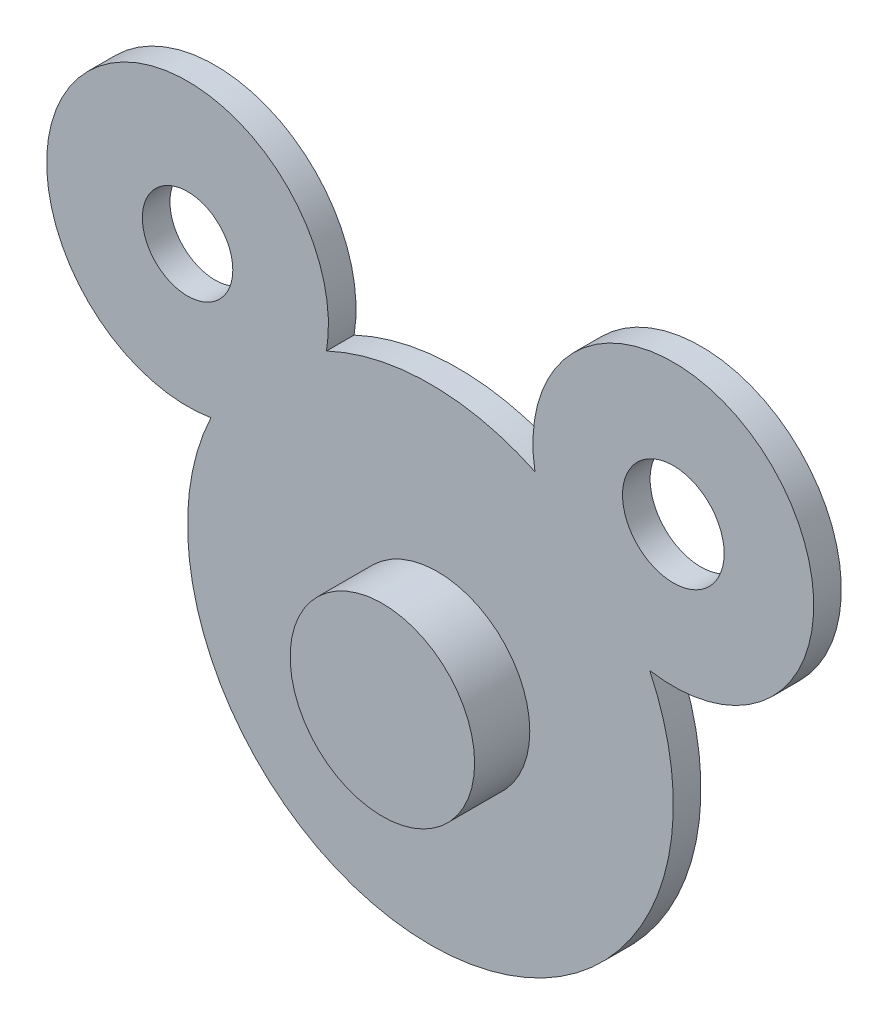
ISO-10303-21;
HEADER;
FILE_DESCRIPTION(('STEP AP214'),'2;1');
FILE_NAME('part.step','',(''),(''),'','','');
FILE_SCHEMA(('AUTOMOTIVE_DESIGN { 1 0 10303 214 1 1 1 1 }'));
ENDSEC;
DATA;
#1=APPLICATION_CONTEXT('core data for automotive mechanical design processes');
#2=APPLICATION_PROTOCOL_DEFINITION('international standard','automotive_design',2000,#1);
#3=PRODUCT_CONTEXT('',#1,'mechanical');
#4=PRODUCT('Part','Part','',(#3));
#5=PRODUCT_RELATED_PRODUCT_CATEGORY('part','',(#4));
#6=PRODUCT_DEFINITION_FORMATION('','',#4);
#7=PRODUCT_DEFINITION_CONTEXT('part definition',#1,'design');
#8=PRODUCT_DEFINITION('design','',#6,#7);
#9=PRODUCT_DEFINITION_SHAPE('','',#8);
#10=(LENGTH_UNIT() NAMED_UNIT(*) SI_UNIT(.MILLI.,.METRE.));
#11=(NAMED_UNIT(*) PLANE_ANGLE_UNIT() SI_UNIT($,.RADIAN.));
#12=(NAMED_UNIT(*) SI_UNIT($,.STERADIAN.) SOLID_ANGLE_UNIT());
#13=UNCERTAINTY_MEASURE_WITH_UNIT(LENGTH_MEASURE(1.E-05),#10,'distance_accuracy_value','');
#14=(GEOMETRIC_REPRESENTATION_CONTEXT(3) GLOBAL_UNCERTAINTY_ASSIGNED_CONTEXT((#13)) GLOBAL_UNIT_ASSIGNED_CONTEXT((#10,
#11,#12)) REPRESENTATION_CONTEXT('',''));
#15=CARTESIAN_POINT('',(0.,0.,0.));
#16=DIRECTION('',(0.,0.,1.));
#17=DIRECTION('',(1.,0.,0.));
#18=AXIS2_PLACEMENT_3D('',#15,#16,#17);
#19=CARTESIAN_POINT('',(-22.365281068635,22.365281068635,5.08));
#20=DIRECTION('',(0.,0.,1.));
#21=DIRECTION('',(1.,0.,0.));
#22=AXIS2_PLACEMENT_3D('',#19,#20,#21);
#23=PLANE('',#22);
#24=CARTESIAN_POINT('',(1.30589739660175,-1.51434166983138,5.08));
#25=DIRECTION('',(0.,0.,1.));
#26=DIRECTION('',(1.,0.,0.));
#27=AXIS2_PLACEMENT_3D('',#24,#25,#26);
#28=CIRCLE('',#27,16.9874269108694);
#29=CARTESIAN_POINT('',(18.2933243074711,-1.51434166983138,5.08));
#30=VERTEX_POINT('',#29);
#31=EDGE_CURVE('E128',#30,#30,#28,.T.);
#32=ORIENTED_EDGE('',*,*,#31,.F.);
#33=EDGE_LOOP('',(#32));
#34=FACE_BOUND('',#33,.T.);
#35=CARTESIAN_POINT('',(-44.7305621372699,44.7305621372699,5.08));
#36=DIRECTION('',(0.,0.,1.));
#37=DIRECTION('',(1.,0.,0.));
#38=AXIS2_PLACEMENT_3D('',#35,#36,#37);
#39=CIRCLE('',#38,8.33296354450895);
#40=CARTESIAN_POINT('',(-36.397598592761,44.7305621372699,5.08));
#41=VERTEX_POINT('',#40);
#42=EDGE_CURVE('E104',#41,#41,#39,.T.);
#43=ORIENTED_EDGE('',*,*,#42,.F.);
#44=EDGE_LOOP('',(#43));
#45=FACE_BOUND('',#44,.T.);
#46=CARTESIAN_POINT('',(0.,0.,5.08));
#47=DIRECTION('',(0.,0.,1.));
#48=DIRECTION('',(1.,0.,0.));
#49=AXIS2_PLACEMENT_3D('',#46,#47,#48);
#50=CIRCLE('',#49,44.7305621372699);
#51=CARTESIAN_POINT('',(19.2419889427091,40.3803052321899,5.08));
#52=VERTEX_POINT('',#51);
#53=CARTESIAN_POINT('',(-19.1426321523269,40.4275008304603,5.08));
#54=VERTEX_POINT('',#53);
#55=EDGE_CURVE('E88',#52,#54,#50,.T.);
#56=ORIENTED_EDGE('',*,*,#55,.T.);
#57=CARTESIAN_POINT('',(-44.7305621372699,44.7305621372699,5.08));
#58=DIRECTION('',(0.,0.,1.));
#59=DIRECTION('',(1.,0.,0.));
#60=AXIS2_PLACEMENT_3D('',#57,#58,#59);
#61=CIRCLE('',#60,25.9472252374798);
#62=CARTESIAN_POINT('',(-40.4275008304603,19.1426321523269,5.08));
#63=VERTEX_POINT('',#62);
#64=EDGE_CURVE('E83',#54,#63,#61,.T.);
#65=ORIENTED_EDGE('',*,*,#64,.T.);
#66=CARTESIAN_POINT('',(0.,0.,5.08));
#67=DIRECTION('',(0.,0.,1.));
#68=DIRECTION('',(1.,0.,0.));
#69=AXIS2_PLACEMENT_3D('',#66,#67,#68);
#70=CIRCLE('',#69,44.7305621372699);
#71=CARTESIAN_POINT('',(40.3803052321899,19.2419889427091,5.08));
#72=VERTEX_POINT('',#71);
#73=EDGE_CURVE('E86',#63,#72,#70,.T.);
#74=ORIENTED_EDGE('',*,*,#73,.T.);
#75=CARTESIAN_POINT('',(44.7305621372699,44.7305621372699,5.08));
#76=DIRECTION('',(0.,0.,1.));
#77=DIRECTION('',(1.,0.,0.));
#78=AXIS2_PLACEMENT_3D('',#75,#76,#77);
#79=CIRCLE('',#78,25.8571479215067);
#80=EDGE_CURVE('E53',#72,#52,#79,.T.);
#81=ORIENTED_EDGE('',*,*,#80,.T.);
#82=EDGE_LOOP('',(#56,#65,#74,#81));
#83=FACE_BOUND('',#82,.T.);
#84=CARTESIAN_POINT('',(44.7305621372699,44.7305621372699,5.08));
#85=DIRECTION('',(0.,0.,1.));
#86=DIRECTION('',(1.,0.,0.));
#87=AXIS2_PLACEMENT_3D('',#84,#85,#86);
#88=CIRCLE('',#87,9.35840883043087);
#89=CARTESIAN_POINT('',(54.0889709677008,44.7305621372699,5.08));
#90=VERTEX_POINT('',#89);
#91=EDGE_CURVE('E119',#90,#90,#88,.T.);
#92=ORIENTED_EDGE('',*,*,#91,.F.);
#93=EDGE_LOOP('',(#92));
#94=FACE_BOUND('',#93,.T.);
#95=ADVANCED_FACE('F35',(#34,#45,#83,#94),#23,.T.);
#96=CARTESIAN_POINT('',(-22.365281068635,22.365281068635,0.));
#97=DIRECTION('',(0.,0.,1.));
#98=DIRECTION('',(1.,0.,0.));
#99=AXIS2_PLACEMENT_3D('',#96,#97,#98);
#100=PLANE('',#99);
#101=CARTESIAN_POINT('',(1.30589739660175,-1.51434166983138,0.));
#102=DIRECTION('',(0.,0.,1.));
#103=DIRECTION('',(1.,0.,0.));
#104=AXIS2_PLACEMENT_3D('',#101,#102,#103);
#105=CIRCLE('',#104,7.51215700132319);
#106=CARTESIAN_POINT('',(8.81805439792494,-1.51434166983138,0.));
#107=VERTEX_POINT('',#106);
#108=EDGE_CURVE('E39',#107,#107,#105,.T.);
#109=ORIENTED_EDGE('',*,*,#108,.T.);
#110=EDGE_LOOP('',(#109));
#111=FACE_BOUND('',#110,.T.);
#112=CARTESIAN_POINT('',(0.,0.,0.));
#113=DIRECTION('',(0.,0.,1.));
#114=DIRECTION('',(1.,0.,0.));
#115=AXIS2_PLACEMENT_3D('',#112,#113,#114);
#116=CIRCLE('',#115,44.7305621372699);
#117=CARTESIAN_POINT('',(19.2419889427091,40.3803052321899,0.));
#118=VERTEX_POINT('',#117);
#119=CARTESIAN_POINT('',(-19.1426321523269,40.4275008304603,0.));
#120=VERTEX_POINT('',#119);
#121=EDGE_CURVE('E101',#118,#120,#116,.T.);
#122=ORIENTED_EDGE('',*,*,#121,.F.);
#123=CARTESIAN_POINT('',(44.7305621372699,44.7305621372699,0.));
#124=DIRECTION('',(0.,0.,1.));
#125=DIRECTION('',(1.,0.,0.));
#126=AXIS2_PLACEMENT_3D('',#123,#124,#125);
#127=CIRCLE('',#126,25.8571479215067);
#128=CARTESIAN_POINT('',(40.3803052321899,19.2419889427091,0.));
#129=VERTEX_POINT('',#128);
#130=EDGE_CURVE('E76',#129,#118,#127,.T.);
#131=ORIENTED_EDGE('',*,*,#130,.F.);
#132=CARTESIAN_POINT('',(0.,0.,0.));
#133=DIRECTION('',(0.,0.,1.));
#134=DIRECTION('',(1.,0.,0.));
#135=AXIS2_PLACEMENT_3D('',#132,#133,#134);
#136=CIRCLE('',#135,44.7305621372699);
#137=CARTESIAN_POINT('',(-40.4275008304603,19.1426321523269,0.));
#138=VERTEX_POINT('',#137);
#139=EDGE_CURVE('E70',#138,#129,#136,.T.);
#140=ORIENTED_EDGE('',*,*,#139,.F.);
#141=CARTESIAN_POINT('',(-44.7305621372699,44.7305621372699,0.));
#142=DIRECTION('',(0.,0.,1.));
#143=DIRECTION('',(1.,0.,0.));
#144=AXIS2_PLACEMENT_3D('',#141,#142,#143);
#145=CIRCLE('',#144,25.9472252374798);
#146=EDGE_CURVE('E92',#120,#138,#145,.T.);
#147=ORIENTED_EDGE('',*,*,#146,.F.);
#148=EDGE_LOOP('',(#122,#131,#140,#147));
#149=FACE_BOUND('',#148,.T.);
#150=CARTESIAN_POINT('',(-44.7305621372699,44.7305621372699,0.));
#151=DIRECTION('',(0.,0.,1.));
#152=DIRECTION('',(1.,0.,0.));
#153=AXIS2_PLACEMENT_3D('',#150,#151,#152);
#154=CIRCLE('',#153,8.33296354450895);
#155=CARTESIAN_POINT('',(-36.397598592761,44.7305621372699,0.));
#156=VERTEX_POINT('',#155);
#157=EDGE_CURVE('E116',#156,#156,#154,.T.);
#158=ORIENTED_EDGE('',*,*,#157,.T.);
#159=EDGE_LOOP('',(#158));
#160=FACE_BOUND('',#159,.T.);
#161=CARTESIAN_POINT('',(44.7305621372699,44.7305621372699,0.));
#162=DIRECTION('',(0.,0.,1.));
#163=DIRECTION('',(1.,0.,0.));
#164=AXIS2_PLACEMENT_3D('',#161,#162,#163);
#165=CIRCLE('',#164,9.35840883043087);
#166=CARTESIAN_POINT('',(54.0889709677008,44.7305621372699,0.));
#167=VERTEX_POINT('',#166);
#168=EDGE_CURVE('E122',#167,#167,#165,.T.);
#169=ORIENTED_EDGE('',*,*,#168,.T.);
#170=EDGE_LOOP('',(#169));
#171=FACE_BOUND('',#170,.T.);
#172=ADVANCED_FACE('F112',(#111,#149,#160,#171),#100,.F.);
#173=CARTESIAN_POINT('',(0.,0.,5.08));
#174=DIRECTION('',(0.,0.,-1.));
#175=DIRECTION('',(-1.,0.,0.));
#176=AXIS2_PLACEMENT_3D('',#173,#174,#175);
#177=CYLINDRICAL_SURFACE('',#176,44.7305621372699);
#178=ORIENTED_EDGE('',*,*,#121,.T.);
#179=DIRECTION('',(0.,0.,-1.));
#180=VECTOR('',#179,1.);
#181=CARTESIAN_POINT('',(-19.1426321523269,40.4275008304603,5.08));
#182=LINE('',#181,#180);
#183=EDGE_CURVE('E11',#54,#120,#182,.T.);
#184=ORIENTED_EDGE('',*,*,#183,.F.);
#185=ORIENTED_EDGE('',*,*,#55,.F.);
#186=DIRECTION('',(0.,0.,-1.));
#187=VECTOR('',#186,1.);
#188=CARTESIAN_POINT('',(19.2419889427091,40.3803052321899,5.08));
#189=LINE('',#188,#187);
#190=EDGE_CURVE('E97',#52,#118,#189,.T.);
#191=ORIENTED_EDGE('',*,*,#190,.T.);
#192=EDGE_LOOP('',(#178,#184,#185,#191));
#193=FACE_BOUND('',#192,.T.);
#194=ADVANCED_FACE('F37',(#193),#177,.T.);
#195=CARTESIAN_POINT('',(-44.7305621372699,44.7305621372699,5.08));
#196=DIRECTION('',(0.,0.,-1.));
#197=DIRECTION('',(-1.,0.,0.));
#198=AXIS2_PLACEMENT_3D('',#195,#196,#197);
#199=CYLINDRICAL_SURFACE('',#198,25.9472252374798);
#200=ORIENTED_EDGE('',*,*,#146,.T.);
#201=DIRECTION('',(0.,0.,-1.));
#202=VECTOR('',#201,1.);
#203=CARTESIAN_POINT('',(-40.4275008304603,19.1426321523269,5.08));
#204=LINE('',#203,#202);
#205=EDGE_CURVE('E45',#63,#138,#204,.T.);
#206=ORIENTED_EDGE('',*,*,#205,.F.);
#207=ORIENTED_EDGE('',*,*,#64,.F.);
#208=ORIENTED_EDGE('',*,*,#183,.T.);
#209=EDGE_LOOP('',(#200,#206,#207,#208));
#210=FACE_BOUND('',#209,.T.);
#211=ADVANCED_FACE('F91',(#210),#199,.T.);
#212=CARTESIAN_POINT('',(0.,0.,5.08));
#213=DIRECTION('',(0.,0.,-1.));
#214=DIRECTION('',(-1.,0.,0.));
#215=AXIS2_PLACEMENT_3D('',#212,#213,#214);
#216=CYLINDRICAL_SURFACE('',#215,44.7305621372699);
#217=ORIENTED_EDGE('',*,*,#139,.T.);
#218=DIRECTION('',(0.,0.,-1.));
#219=VECTOR('',#218,1.);
#220=CARTESIAN_POINT('',(40.3803052321899,19.2419889427091,5.08));
#221=LINE('',#220,#219);
#222=EDGE_CURVE('E93',#72,#129,#221,.T.);
#223=ORIENTED_EDGE('',*,*,#222,.F.);
#224=ORIENTED_EDGE('',*,*,#73,.F.);
#225=ORIENTED_EDGE('',*,*,#205,.T.);
#226=EDGE_LOOP('',(#217,#223,#224,#225));
#227=FACE_BOUND('',#226,.T.);
#228=ADVANCED_FACE('F95',(#227),#216,.T.);
#229=CARTESIAN_POINT('',(44.7305621372699,44.7305621372699,5.08));
#230=DIRECTION('',(0.,0.,-1.));
#231=DIRECTION('',(-1.,0.,0.));
#232=AXIS2_PLACEMENT_3D('',#229,#230,#231);
#233=CYLINDRICAL_SURFACE('',#232,25.8571479215067);
#234=ORIENTED_EDGE('',*,*,#130,.T.);
#235=ORIENTED_EDGE('',*,*,#190,.F.);
#236=ORIENTED_EDGE('',*,*,#80,.F.);
#237=ORIENTED_EDGE('',*,*,#222,.T.);
#238=EDGE_LOOP('',(#234,#235,#236,#237));
#239=FACE_BOUND('',#238,.T.);
#240=ADVANCED_FACE('F109',(#239),#233,.T.);
#241=CARTESIAN_POINT('',(-44.7305621372699,44.7305621372699,5.08));
#242=DIRECTION('',(0.,0.,-1.));
#243=DIRECTION('',(-1.,0.,0.));
#244=AXIS2_PLACEMENT_3D('',#241,#242,#243);
#245=CYLINDRICAL_SURFACE('',#244,8.33296354450895);
#246=ORIENTED_EDGE('',*,*,#42,.T.);
#247=EDGE_LOOP('',(#246));
#248=FACE_BOUND('',#247,.T.);
#249=ORIENTED_EDGE('',*,*,#157,.F.);
#250=EDGE_LOOP('',(#249));
#251=FACE_BOUND('',#250,.T.);
#252=ADVANCED_FACE('F165',(#248,#251),#245,.F.);
#253=CARTESIAN_POINT('',(44.7305621372699,44.7305621372699,5.08));
#254=DIRECTION('',(0.,0.,-1.));
#255=DIRECTION('',(-1.,0.,0.));
#256=AXIS2_PLACEMENT_3D('',#253,#254,#255);
#257=CYLINDRICAL_SURFACE('',#256,9.35840883043087);
#258=ORIENTED_EDGE('',*,*,#91,.T.);
#259=EDGE_LOOP('',(#258));
#260=FACE_BOUND('',#259,.T.);
#261=ORIENTED_EDGE('',*,*,#168,.F.);
#262=EDGE_LOOP('',(#261));
#263=FACE_BOUND('',#262,.T.);
#264=ADVANCED_FACE('F210',(#260,#263),#257,.F.);
#265=CARTESIAN_POINT('',(1.30589739660175,-1.51434166983138,15.24));
#266=DIRECTION('',(0.,0.,-1.));
#267=DIRECTION('',(-1.,0.,0.));
#268=AXIS2_PLACEMENT_3D('',#265,#266,#267);
#269=CYLINDRICAL_SURFACE('',#268,16.9874269108694);
#270=CARTESIAN_POINT('',(1.30589739660175,-1.51434166983138,15.24));
#271=DIRECTION('',(0.,0.,1.));
#272=DIRECTION('',(1.,0.,0.));
#273=AXIS2_PLACEMENT_3D('',#270,#271,#272);
#274=CIRCLE('',#273,16.9874269108694);
#275=CARTESIAN_POINT('',(18.2933243074711,-1.51434166983138,15.24));
#276=VERTEX_POINT('',#275);
#277=EDGE_CURVE('E125',#276,#276,#274,.T.);
#278=ORIENTED_EDGE('',*,*,#277,.F.);
#279=EDGE_LOOP('',(#278));
#280=FACE_BOUND('',#279,.T.);
#281=ORIENTED_EDGE('',*,*,#31,.T.);
#282=EDGE_LOOP('',(#281));
#283=FACE_BOUND('',#282,.T.);
#284=ADVANCED_FACE('F152',(#280,#283),#269,.T.);
#285=CARTESIAN_POINT('',(1.30589739660175,-1.51434166983138,15.24));
#286=DIRECTION('',(0.,0.,1.));
#287=DIRECTION('',(1.,0.,0.));
#288=AXIS2_PLACEMENT_3D('',#285,#286,#287);
#289=PLANE('',#288);
#290=ORIENTED_EDGE('',*,*,#277,.T.);
#291=EDGE_LOOP('',(#290));
#292=FACE_BOUND('',#291,.T.);
#293=ADVANCED_FACE('F144',(#292),#289,.T.);
#294=CARTESIAN_POINT('',(1.30589739660175,-1.51434166983138,-5.08));
#295=DIRECTION('',(0.,0.,1.));
#296=DIRECTION('',(1.,0.,0.));
#297=AXIS2_PLACEMENT_3D('',#294,#295,#296);
#298=CYLINDRICAL_SURFACE('',#297,7.51215700132319);
#299=CARTESIAN_POINT('',(1.30589739660175,-1.51434166983138,5.08));
#300=DIRECTION('',(0.,0.,1.));
#301=DIRECTION('',(1.,0.,0.));
#302=AXIS2_PLACEMENT_3D('',#299,#300,#301);
#303=CIRCLE('',#302,7.51215700132319);
#304=CARTESIAN_POINT('',(8.81805439792494,-1.51434166983138,5.08));
#305=VERTEX_POINT('',#304);
#306=EDGE_CURVE('E133',#305,#305,#303,.T.);
#307=ORIENTED_EDGE('',*,*,#306,.T.);
#308=EDGE_LOOP('',(#307));
#309=FACE_BOUND('',#308,.T.);
#310=ORIENTED_EDGE('',*,*,#108,.F.);
#311=EDGE_LOOP('',(#310));
#312=FACE_BOUND('',#311,.T.);
#313=ADVANCED_FACE('F141',(#309,#312),#298,.F.);
#314=CARTESIAN_POINT('',(1.30589739660175,-1.51434166983138,5.08));
#315=DIRECTION('',(0.,0.,1.));
#316=DIRECTION('',(1.,0.,0.));
#317=AXIS2_PLACEMENT_3D('',#314,#315,#316);
#318=PLANE('',#317);
#319=ORIENTED_EDGE('',*,*,#306,.F.);
#320=EDGE_LOOP('',(#319));
#321=FACE_BOUND('',#320,.T.);
#322=ADVANCED_FACE('F143',(#321),#318,.F.);
#323=CLOSED_SHELL('',(#95,#172,#194,#211,#228,#240,#252,#264,#284,#293,#313,#322));
#324=MANIFOLD_SOLID_BREP('B2',#323);
#325=ADVANCED_BREP_SHAPE_REPRESENTATION('',(#18,#324),#14);
#326=SHAPE_DEFINITION_REPRESENTATION(#9,#325);
ENDSEC;
END-ISO-10303-21;
